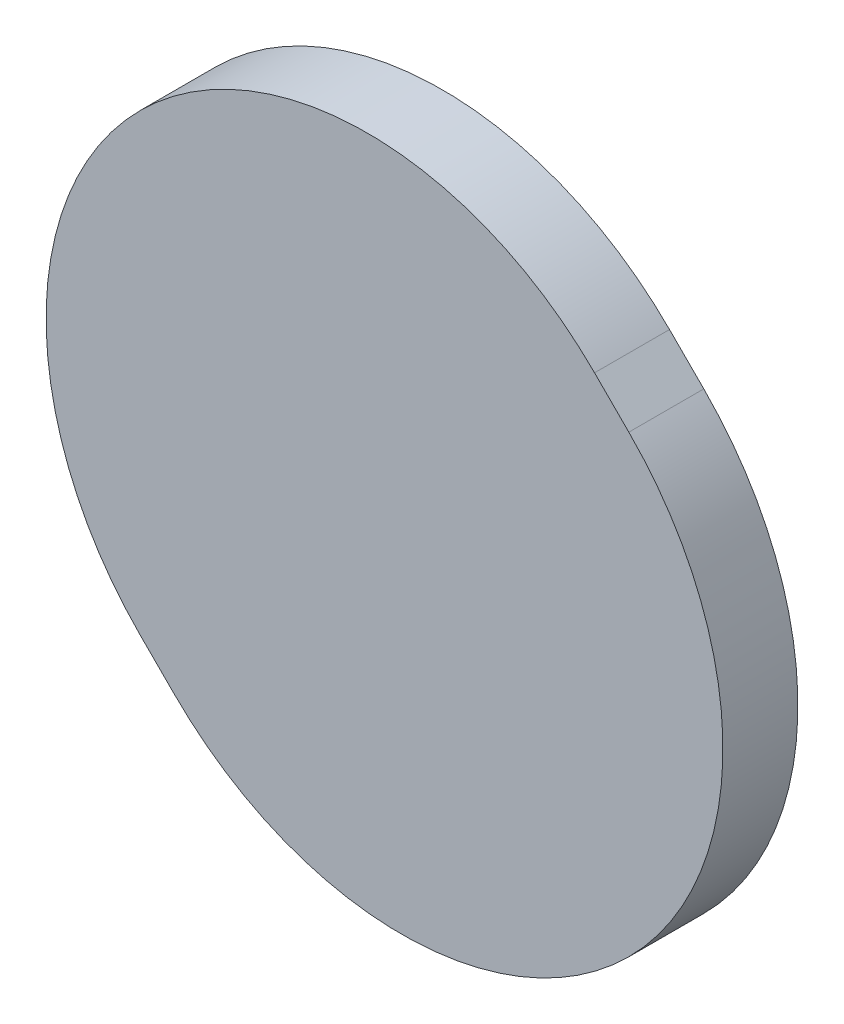
ISO-10303-21;
HEADER;
FILE_DESCRIPTION(('STEP AP214'),'2;1');
FILE_NAME('part.step','',(''),(''),'','','');
FILE_SCHEMA(('AUTOMOTIVE_DESIGN { 1 0 10303 214 1 1 1 1 }'));
ENDSEC;
DATA;
#1=APPLICATION_CONTEXT('core data for automotive mechanical design processes');
#2=APPLICATION_PROTOCOL_DEFINITION('international standard','automotive_design',2000,#1);
#3=PRODUCT_CONTEXT('',#1,'mechanical');
#4=PRODUCT('Part','Part','',(#3));
#5=PRODUCT_RELATED_PRODUCT_CATEGORY('part','',(#4));
#6=PRODUCT_DEFINITION_FORMATION('','',#4);
#7=PRODUCT_DEFINITION_CONTEXT('part definition',#1,'design');
#8=PRODUCT_DEFINITION('design','',#6,#7);
#9=PRODUCT_DEFINITION_SHAPE('','',#8);
#10=(LENGTH_UNIT() NAMED_UNIT(*) SI_UNIT(.MILLI.,.METRE.));
#11=(NAMED_UNIT(*) PLANE_ANGLE_UNIT() SI_UNIT($,.RADIAN.));
#12=(NAMED_UNIT(*) SI_UNIT($,.STERADIAN.) SOLID_ANGLE_UNIT());
#13=UNCERTAINTY_MEASURE_WITH_UNIT(LENGTH_MEASURE(1.E-05),#10,'distance_accuracy_value','');
#14=(GEOMETRIC_REPRESENTATION_CONTEXT(3) GLOBAL_UNCERTAINTY_ASSIGNED_CONTEXT((#13)) GLOBAL_UNIT_ASSIGNED_CONTEXT((#10,
#11,#12)) REPRESENTATION_CONTEXT('',''));
#15=CARTESIAN_POINT('',(0.,0.,0.));
#16=DIRECTION('',(0.,0.,1.));
#17=DIRECTION('',(1.,0.,0.));
#18=AXIS2_PLACEMENT_3D('',#15,#16,#17);
#19=CARTESIAN_POINT('',(117.326066,-116.442933,1.635));
#20=DIRECTION('',(0.,0.,1.));
#21=DIRECTION('',(1.,0.,0.));
#22=AXIS2_PLACEMENT_3D('',#19,#20,#21);
#23=PLANE('',#22);
#24=DIRECTION('',(-0.707106781186548,0.707106781186548,0.));
#25=VECTOR('',#24,1.);
#26=CARTESIAN_POINT('',(117.326066,-116.442933,1.635));
#27=LINE('',#26,#25);
#28=CARTESIAN_POINT('',(117.326066,-116.442933,1.635));
#29=VERTEX_POINT('',#28);
#30=CARTESIAN_POINT('',(117.310066,-116.426933,1.635));
#31=VERTEX_POINT('',#30);
#32=EDGE_CURVE('E79',#29,#31,#27,.T.);
#33=ORIENTED_EDGE('',*,*,#32,.T.);
#34=CARTESIAN_POINT('',(117.2039995,-116.5329995,1.635));
#35=DIRECTION('',(0.,0.,1.));
#36=DIRECTION('',(0.707106781186548,0.707106781186548,0.));
#37=AXIS2_PLACEMENT_3D('',#34,#35,#36);
#38=CIRCLE('',#37,0.150000682813);
#39=CARTESIAN_POINT('',(117.097933,-116.639066,1.635));
#40=VERTEX_POINT('',#39);
#41=EDGE_CURVE('E77',#31,#40,#38,.T.);
#42=ORIENTED_EDGE('',*,*,#41,.T.);
#43=DIRECTION('',(0.707106781186548,-0.707106781186548,0.));
#44=VECTOR('',#43,1.);
#45=CARTESIAN_POINT('',(117.097933,-116.639066,1.635));
#46=LINE('',#45,#44);
#47=CARTESIAN_POINT('',(117.113933,-116.655066,1.635));
#48=VERTEX_POINT('',#47);
#49=EDGE_CURVE('E66',#40,#48,#46,.T.);
#50=ORIENTED_EDGE('',*,*,#49,.T.);
#51=CARTESIAN_POINT('',(117.2199995,-116.5489995,1.635));
#52=DIRECTION('',(0.,0.,1.));
#53=DIRECTION('',(-0.707106781186548,-0.707106781186548,0.));
#54=AXIS2_PLACEMENT_3D('',#51,#52,#53);
#55=CIRCLE('',#54,0.150000682813);
#56=EDGE_CURVE('E11',#48,#29,#55,.T.);
#57=ORIENTED_EDGE('',*,*,#56,.T.);
#58=EDGE_LOOP('',(#33,#42,#50,#57));
#59=FACE_BOUND('',#58,.T.);
#60=ADVANCED_FACE('F17',(#59),#23,.T.);
#61=CARTESIAN_POINT('',(117.326066,-116.442933,1.6));
#62=DIRECTION('',(0.,0.,1.));
#63=DIRECTION('',(1.,0.,0.));
#64=AXIS2_PLACEMENT_3D('',#61,#62,#63);
#65=PLANE('',#64);
#66=CARTESIAN_POINT('',(117.2199995,-116.5489995,1.6));
#67=DIRECTION('',(0.,0.,1.));
#68=DIRECTION('',(-0.707106781186548,-0.707106781186548,0.));
#69=AXIS2_PLACEMENT_3D('',#66,#67,#68);
#70=CIRCLE('',#69,0.150000682813);
#71=CARTESIAN_POINT('',(117.113933,-116.655066,1.6));
#72=VERTEX_POINT('',#71);
#73=CARTESIAN_POINT('',(117.326066,-116.442933,1.6));
#74=VERTEX_POINT('',#73);
#75=EDGE_CURVE('E26',#72,#74,#70,.T.);
#76=ORIENTED_EDGE('',*,*,#75,.F.);
#77=DIRECTION('',(0.707106781186548,-0.707106781186548,0.));
#78=VECTOR('',#77,1.);
#79=CARTESIAN_POINT('',(117.097933,-116.639066,1.6));
#80=LINE('',#79,#78);
#81=CARTESIAN_POINT('',(117.097933,-116.639066,1.6));
#82=VERTEX_POINT('',#81);
#83=EDGE_CURVE('E59',#82,#72,#80,.T.);
#84=ORIENTED_EDGE('',*,*,#83,.F.);
#85=CARTESIAN_POINT('',(117.2039995,-116.5329995,1.6));
#86=DIRECTION('',(0.,0.,1.));
#87=DIRECTION('',(0.707106781186548,0.707106781186548,0.));
#88=AXIS2_PLACEMENT_3D('',#85,#86,#87);
#89=CIRCLE('',#88,0.150000682813);
#90=CARTESIAN_POINT('',(117.310066,-116.426933,1.6));
#91=VERTEX_POINT('',#90);
#92=EDGE_CURVE('E86',#91,#82,#89,.T.);
#93=ORIENTED_EDGE('',*,*,#92,.F.);
#94=DIRECTION('',(-0.707106781186548,0.707106781186548,0.));
#95=VECTOR('',#94,1.);
#96=CARTESIAN_POINT('',(117.326066,-116.442933,1.6));
#97=LINE('',#96,#95);
#98=EDGE_CURVE('E112',#74,#91,#97,.T.);
#99=ORIENTED_EDGE('',*,*,#98,.F.);
#100=EDGE_LOOP('',(#76,#84,#93,#99));
#101=FACE_BOUND('',#100,.T.);
#102=ADVANCED_FACE('F122',(#101),#65,.F.);
#103=CARTESIAN_POINT('',(117.2199995,-116.5489995,1.6));
#104=DIRECTION('',(0.,0.,-1.));
#105=DIRECTION('',(-0.707106781186548,-0.707106781186548,0.));
#106=AXIS2_PLACEMENT_3D('',#103,#104,#105);
#107=CYLINDRICAL_SURFACE('',#106,0.150000682813);
#108=ORIENTED_EDGE('',*,*,#75,.T.);
#109=DIRECTION('',(0.,0.,1.));
#110=VECTOR('',#109,1.);
#111=CARTESIAN_POINT('',(117.326066,-116.442933,1.6));
#112=LINE('',#111,#110);
#113=EDGE_CURVE('E93',#74,#29,#112,.T.);
#114=ORIENTED_EDGE('',*,*,#113,.T.);
#115=ORIENTED_EDGE('',*,*,#56,.F.);
#116=DIRECTION('',(0.,0.,1.));
#117=VECTOR('',#116,1.);
#118=CARTESIAN_POINT('',(117.113933,-116.655066,1.6));
#119=LINE('',#118,#117);
#120=EDGE_CURVE('E72',#72,#48,#119,.T.);
#121=ORIENTED_EDGE('',*,*,#120,.F.);
#122=EDGE_LOOP('',(#108,#114,#115,#121));
#123=FACE_BOUND('',#122,.T.);
#124=ADVANCED_FACE('F125',(#123),#107,.T.);
#125=CARTESIAN_POINT('',(117.097933,-116.639066,1.6));
#126=DIRECTION('',(0.707106781186548,0.707106781186548,0.));
#127=DIRECTION('',(0.,0.,-1.));
#128=AXIS2_PLACEMENT_3D('',#125,#126,#127);
#129=PLANE('',#128);
#130=ORIENTED_EDGE('',*,*,#83,.T.);
#131=ORIENTED_EDGE('',*,*,#120,.T.);
#132=ORIENTED_EDGE('',*,*,#49,.F.);
#133=DIRECTION('',(0.,0.,1.));
#134=VECTOR('',#133,1.);
#135=CARTESIAN_POINT('',(117.097933,-116.639066,1.6));
#136=LINE('',#135,#134);
#137=EDGE_CURVE('E70',#82,#40,#136,.T.);
#138=ORIENTED_EDGE('',*,*,#137,.F.);
#139=EDGE_LOOP('',(#130,#131,#132,#138));
#140=FACE_BOUND('',#139,.T.);
#141=ADVANCED_FACE('F68',(#140),#129,.F.);
#142=CARTESIAN_POINT('',(117.2039995,-116.5329995,1.6));
#143=DIRECTION('',(0.,0.,-1.));
#144=DIRECTION('',(0.707106781186548,0.707106781186548,0.));
#145=AXIS2_PLACEMENT_3D('',#142,#143,#144);
#146=CYLINDRICAL_SURFACE('',#145,0.150000682813);
#147=ORIENTED_EDGE('',*,*,#92,.T.);
#148=ORIENTED_EDGE('',*,*,#137,.T.);
#149=ORIENTED_EDGE('',*,*,#41,.F.);
#150=DIRECTION('',(0.,0.,1.));
#151=VECTOR('',#150,1.);
#152=CARTESIAN_POINT('',(117.310066,-116.426933,1.6));
#153=LINE('',#152,#151);
#154=EDGE_CURVE('E105',#91,#31,#153,.T.);
#155=ORIENTED_EDGE('',*,*,#154,.F.);
#156=EDGE_LOOP('',(#147,#148,#149,#155));
#157=FACE_BOUND('',#156,.T.);
#158=ADVANCED_FACE('F85',(#157),#146,.T.);
#159=CARTESIAN_POINT('',(117.326066,-116.442933,1.6));
#160=DIRECTION('',(-0.707106781186548,-0.707106781186548,0.));
#161=DIRECTION('',(-0.707106781186548,0.707106781186548,0.));
#162=AXIS2_PLACEMENT_3D('',#159,#160,#161);
#163=PLANE('',#162);
#164=ORIENTED_EDGE('',*,*,#98,.T.);
#165=ORIENTED_EDGE('',*,*,#154,.T.);
#166=ORIENTED_EDGE('',*,*,#32,.F.);
#167=ORIENTED_EDGE('',*,*,#113,.F.);
#168=EDGE_LOOP('',(#164,#165,#166,#167));
#169=FACE_BOUND('',#168,.T.);
#170=ADVANCED_FACE('F120',(#169),#163,.F.);
#171=CLOSED_SHELL('',(#60,#102,#124,#141,#158,#170));
#172=MANIFOLD_SOLID_BREP('B1',#171);
#173=ADVANCED_BREP_SHAPE_REPRESENTATION('',(#18,#172),#14);
#174=SHAPE_DEFINITION_REPRESENTATION(#9,#173);
ENDSEC;
END-ISO-10303-21;
